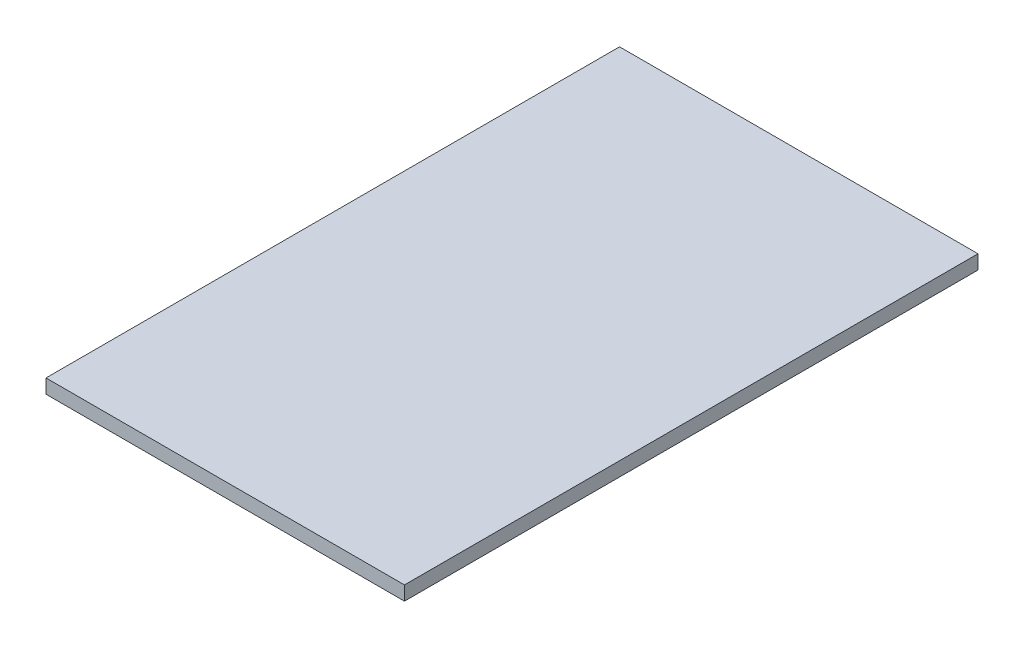
ISO-10303-21;
HEADER;
FILE_DESCRIPTION(('STEP AP214'),'2;1');
FILE_NAME('part.step','',(''),(''),'','','');
FILE_SCHEMA(('AUTOMOTIVE_DESIGN { 1 0 10303 214 1 1 1 1 }'));
ENDSEC;
DATA;
#1=APPLICATION_CONTEXT('core data for automotive mechanical design processes');
#2=APPLICATION_PROTOCOL_DEFINITION('international standard','automotive_design',2000,#1);
#3=PRODUCT_CONTEXT('',#1,'mechanical');
#4=PRODUCT('Part','Part','',(#3));
#5=PRODUCT_RELATED_PRODUCT_CATEGORY('part','',(#4));
#6=PRODUCT_DEFINITION_FORMATION('','',#4);
#7=PRODUCT_DEFINITION_CONTEXT('part definition',#1,'design');
#8=PRODUCT_DEFINITION('design','',#6,#7);
#9=PRODUCT_DEFINITION_SHAPE('','',#8);
#10=(LENGTH_UNIT() NAMED_UNIT(*) SI_UNIT(.MILLI.,.METRE.));
#11=(NAMED_UNIT(*) PLANE_ANGLE_UNIT() SI_UNIT($,.RADIAN.));
#12=(NAMED_UNIT(*) SI_UNIT($,.STERADIAN.) SOLID_ANGLE_UNIT());
#13=UNCERTAINTY_MEASURE_WITH_UNIT(LENGTH_MEASURE(1.E-05),#10,'distance_accuracy_value','');
#14=(GEOMETRIC_REPRESENTATION_CONTEXT(3) GLOBAL_UNCERTAINTY_ASSIGNED_CONTEXT((#13)) GLOBAL_UNIT_ASSIGNED_CONTEXT((#10,
#11,#12)) REPRESENTATION_CONTEXT('',''));
#15=CARTESIAN_POINT('',(0.,0.,0.));
#16=DIRECTION('',(0.,0.,1.));
#17=DIRECTION('',(1.,0.,0.));
#18=AXIS2_PLACEMENT_3D('',#15,#16,#17);
#19=CARTESIAN_POINT('',(127.,10.,203.2));
#20=DIRECTION('',(-1.,0.,0.));
#21=DIRECTION('',(0.,0.,1.));
#22=AXIS2_PLACEMENT_3D('',#19,#20,#21);
#23=PLANE('',#22);
#24=DIRECTION('',(0.,0.,-1.));
#25=VECTOR('',#24,1.);
#26=CARTESIAN_POINT('',(127.,0.,203.2));
#27=LINE('',#26,#25);
#28=CARTESIAN_POINT('',(127.,0.,203.2));
#29=VERTEX_POINT('',#28);
#30=CARTESIAN_POINT('',(127.,0.,-203.2));
#31=VERTEX_POINT('',#30);
#32=EDGE_CURVE('E96',#29,#31,#27,.T.);
#33=ORIENTED_EDGE('',*,*,#32,.T.);
#34=DIRECTION('',(0.,-1.,0.));
#35=VECTOR('',#34,1.);
#36=CARTESIAN_POINT('',(127.,10.,-203.2));
#37=LINE('',#36,#35);
#38=CARTESIAN_POINT('',(127.,10.,-203.2));
#39=VERTEX_POINT('',#38);
#40=EDGE_CURVE('E11',#39,#31,#37,.T.);
#41=ORIENTED_EDGE('',*,*,#40,.F.);
#42=DIRECTION('',(0.,0.,-1.));
#43=VECTOR('',#42,1.);
#44=CARTESIAN_POINT('',(127.,10.,203.2));
#45=LINE('',#44,#43);
#46=CARTESIAN_POINT('',(127.,10.,203.2));
#47=VERTEX_POINT('',#46);
#48=EDGE_CURVE('E84',#47,#39,#45,.T.);
#49=ORIENTED_EDGE('',*,*,#48,.F.);
#50=DIRECTION('',(0.,-1.,0.));
#51=VECTOR('',#50,1.);
#52=CARTESIAN_POINT('',(127.,10.,203.2));
#53=LINE('',#52,#51);
#54=EDGE_CURVE('E92',#47,#29,#53,.T.);
#55=ORIENTED_EDGE('',*,*,#54,.T.);
#56=EDGE_LOOP('',(#33,#41,#49,#55));
#57=FACE_BOUND('',#56,.T.);
#58=ADVANCED_FACE('F33',(#57),#23,.F.);
#59=CARTESIAN_POINT('',(-127.,10.,-203.2));
#60=DIRECTION('',(0.,0.,1.));
#61=DIRECTION('',(1.,0.,0.));
#62=AXIS2_PLACEMENT_3D('',#59,#60,#61);
#63=PLANE('',#62);
#64=DIRECTION('',(-1.,0.,0.));
#65=VECTOR('',#64,1.);
#66=CARTESIAN_POINT('',(-127.,0.,-203.2));
#67=LINE('',#66,#65);
#68=CARTESIAN_POINT('',(-127.,0.,-203.2));
#69=VERTEX_POINT('',#68);
#70=EDGE_CURVE('E88',#31,#69,#67,.T.);
#71=ORIENTED_EDGE('',*,*,#70,.T.);
#72=DIRECTION('',(0.,-1.,0.));
#73=VECTOR('',#72,1.);
#74=CARTESIAN_POINT('',(-127.,10.,-203.2));
#75=LINE('',#74,#73);
#76=CARTESIAN_POINT('',(-127.,10.,-203.2));
#77=VERTEX_POINT('',#76);
#78=EDGE_CURVE('E41',#77,#69,#75,.T.);
#79=ORIENTED_EDGE('',*,*,#78,.F.);
#80=DIRECTION('',(-1.,0.,0.));
#81=VECTOR('',#80,1.);
#82=CARTESIAN_POINT('',(-127.,10.,-203.2));
#83=LINE('',#82,#81);
#84=EDGE_CURVE('E79',#39,#77,#83,.T.);
#85=ORIENTED_EDGE('',*,*,#84,.F.);
#86=ORIENTED_EDGE('',*,*,#40,.T.);
#87=EDGE_LOOP('',(#71,#79,#85,#86));
#88=FACE_BOUND('',#87,.T.);
#89=ADVANCED_FACE('F87',(#88),#63,.F.);
#90=CARTESIAN_POINT('',(-127.,10.,203.2));
#91=DIRECTION('',(1.,0.,0.));
#92=DIRECTION('',(0.,0.,-1.));
#93=AXIS2_PLACEMENT_3D('',#90,#91,#92);
#94=PLANE('',#93);
#95=DIRECTION('',(0.,0.,1.));
#96=VECTOR('',#95,1.);
#97=CARTESIAN_POINT('',(-127.,0.,203.2));
#98=LINE('',#97,#96);
#99=CARTESIAN_POINT('',(-127.,0.,203.2));
#100=VERTEX_POINT('',#99);
#101=EDGE_CURVE('E66',#69,#100,#98,.T.);
#102=ORIENTED_EDGE('',*,*,#101,.T.);
#103=DIRECTION('',(0.,-1.,0.));
#104=VECTOR('',#103,1.);
#105=CARTESIAN_POINT('',(-127.,10.,203.2));
#106=LINE('',#105,#104);
#107=CARTESIAN_POINT('',(-127.,10.,203.2));
#108=VERTEX_POINT('',#107);
#109=EDGE_CURVE('E89',#108,#100,#106,.T.);
#110=ORIENTED_EDGE('',*,*,#109,.F.);
#111=DIRECTION('',(0.,0.,1.));
#112=VECTOR('',#111,1.);
#113=CARTESIAN_POINT('',(-127.,10.,203.2));
#114=LINE('',#113,#112);
#115=EDGE_CURVE('E82',#77,#108,#114,.T.);
#116=ORIENTED_EDGE('',*,*,#115,.F.);
#117=ORIENTED_EDGE('',*,*,#78,.T.);
#118=EDGE_LOOP('',(#102,#110,#116,#117));
#119=FACE_BOUND('',#118,.T.);
#120=ADVANCED_FACE('F90',(#119),#94,.F.);
#121=CARTESIAN_POINT('',(-127.,10.,203.2));
#122=DIRECTION('',(0.,0.,-1.));
#123=DIRECTION('',(-1.,0.,0.));
#124=AXIS2_PLACEMENT_3D('',#121,#122,#123);
#125=PLANE('',#124);
#126=DIRECTION('',(1.,0.,0.));
#127=VECTOR('',#126,1.);
#128=CARTESIAN_POINT('',(-127.,0.,203.2));
#129=LINE('',#128,#127);
#130=EDGE_CURVE('E72',#100,#29,#129,.T.);
#131=ORIENTED_EDGE('',*,*,#130,.T.);
#132=ORIENTED_EDGE('',*,*,#54,.F.);
#133=DIRECTION('',(1.,0.,0.));
#134=VECTOR('',#133,1.);
#135=CARTESIAN_POINT('',(-127.,10.,203.2));
#136=LINE('',#135,#134);
#137=EDGE_CURVE('E49',#108,#47,#136,.T.);
#138=ORIENTED_EDGE('',*,*,#137,.F.);
#139=ORIENTED_EDGE('',*,*,#109,.T.);
#140=EDGE_LOOP('',(#131,#132,#138,#139));
#141=FACE_BOUND('',#140,.T.);
#142=ADVANCED_FACE('F103',(#141),#125,.F.);
#143=CARTESIAN_POINT('',(0.,10.,0.));
#144=DIRECTION('',(0.,-1.,0.));
#145=DIRECTION('',(0.,0.,-1.));
#146=AXIS2_PLACEMENT_3D('',#143,#144,#145);
#147=PLANE('',#146);
#148=ORIENTED_EDGE('',*,*,#48,.T.);
#149=ORIENTED_EDGE('',*,*,#84,.T.);
#150=ORIENTED_EDGE('',*,*,#115,.T.);
#151=ORIENTED_EDGE('',*,*,#137,.T.);
#152=EDGE_LOOP('',(#148,#149,#150,#151));
#153=FACE_BOUND('',#152,.T.);
#154=ADVANCED_FACE('F80',(#153),#147,.F.);
#155=CARTESIAN_POINT('',(0.,0.,0.));
#156=DIRECTION('',(0.,-1.,0.));
#157=DIRECTION('',(0.,0.,-1.));
#158=AXIS2_PLACEMENT_3D('',#155,#156,#157);
#159=PLANE('',#158);
#160=ORIENTED_EDGE('',*,*,#32,.F.);
#161=ORIENTED_EDGE('',*,*,#130,.F.);
#162=ORIENTED_EDGE('',*,*,#101,.F.);
#163=ORIENTED_EDGE('',*,*,#70,.F.);
#164=EDGE_LOOP('',(#160,#161,#162,#163));
#165=FACE_BOUND('',#164,.T.);
#166=ADVANCED_FACE('F106',(#165),#159,.T.);
#167=CLOSED_SHELL('',(#58,#89,#120,#142,#154,#166));
#168=MANIFOLD_SOLID_BREP('B2',#167);
#169=ADVANCED_BREP_SHAPE_REPRESENTATION('',(#18,#168),#14);
#170=SHAPE_DEFINITION_REPRESENTATION(#9,#169);
ENDSEC;
END-ISO-10303-21;
